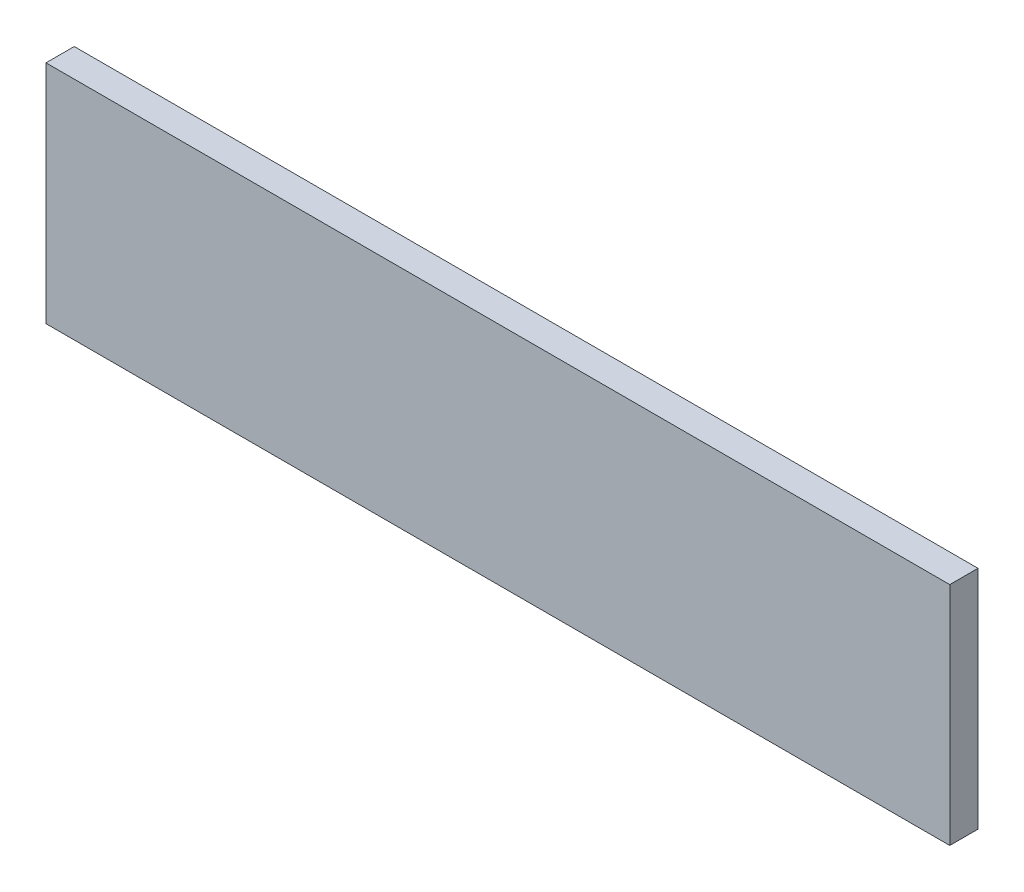
ISO-10303-21;
HEADER;
FILE_DESCRIPTION(('STEP AP214'),'2;1');
FILE_NAME('part.step','',(''),(''),'','','');
FILE_SCHEMA(('AUTOMOTIVE_DESIGN { 1 0 10303 214 1 1 1 1 }'));
ENDSEC;
DATA;
#1=APPLICATION_CONTEXT('core data for automotive mechanical design processes');
#2=APPLICATION_PROTOCOL_DEFINITION('international standard','automotive_design',2000,#1);
#3=PRODUCT_CONTEXT('',#1,'mechanical');
#4=PRODUCT('Part','Part','',(#3));
#5=PRODUCT_RELATED_PRODUCT_CATEGORY('part','',(#4));
#6=PRODUCT_DEFINITION_FORMATION('','',#4);
#7=PRODUCT_DEFINITION_CONTEXT('part definition',#1,'design');
#8=PRODUCT_DEFINITION('design','',#6,#7);
#9=PRODUCT_DEFINITION_SHAPE('','',#8);
#10=(LENGTH_UNIT() NAMED_UNIT(*) SI_UNIT(.MILLI.,.METRE.));
#11=(NAMED_UNIT(*) PLANE_ANGLE_UNIT() SI_UNIT($,.RADIAN.));
#12=(NAMED_UNIT(*) SI_UNIT($,.STERADIAN.) SOLID_ANGLE_UNIT());
#13=UNCERTAINTY_MEASURE_WITH_UNIT(LENGTH_MEASURE(1.E-05),#10,'distance_accuracy_value','');
#14=(GEOMETRIC_REPRESENTATION_CONTEXT(3) GLOBAL_UNCERTAINTY_ASSIGNED_CONTEXT((#13)) GLOBAL_UNIT_ASSIGNED_CONTEXT((#10,
#11,#12)) REPRESENTATION_CONTEXT('',''));
#15=CARTESIAN_POINT('',(0.,0.,0.));
#16=DIRECTION('',(0.,0.,1.));
#17=DIRECTION('',(1.,0.,0.));
#18=AXIS2_PLACEMENT_3D('',#15,#16,#17);
#19=CARTESIAN_POINT('',(50.8,-12.7,1.5875));
#20=DIRECTION('',(-1.,0.,0.));
#21=DIRECTION('',(0.,0.,1.));
#22=AXIS2_PLACEMENT_3D('',#19,#20,#21);
#23=PLANE('',#22);
#24=DIRECTION('',(0.,1.,0.));
#25=VECTOR('',#24,1.);
#26=CARTESIAN_POINT('',(50.8,-12.7,-1.5875));
#27=LINE('',#26,#25);
#28=CARTESIAN_POINT('',(50.8,-12.7,-1.5875));
#29=VERTEX_POINT('',#28);
#30=CARTESIAN_POINT('',(50.8,12.7,-1.5875));
#31=VERTEX_POINT('',#30);
#32=EDGE_CURVE('E113',#29,#31,#27,.T.);
#33=ORIENTED_EDGE('',*,*,#32,.T.);
#34=DIRECTION('',(0.,0.,-1.));
#35=VECTOR('',#34,1.);
#36=CARTESIAN_POINT('',(50.8,12.7,1.5875));
#37=LINE('',#36,#35);
#38=CARTESIAN_POINT('',(50.8,12.7,1.5875));
#39=VERTEX_POINT('',#38);
#40=EDGE_CURVE('E11',#39,#31,#37,.T.);
#41=ORIENTED_EDGE('',*,*,#40,.F.);
#42=DIRECTION('',(0.,1.,0.));
#43=VECTOR('',#42,1.);
#44=CARTESIAN_POINT('',(50.8,-12.7,1.5875));
#45=LINE('',#44,#43);
#46=CARTESIAN_POINT('',(50.8,-12.7,1.5875));
#47=VERTEX_POINT('',#46);
#48=EDGE_CURVE('E97',#47,#39,#45,.T.);
#49=ORIENTED_EDGE('',*,*,#48,.F.);
#50=DIRECTION('',(0.,0.,-1.));
#51=VECTOR('',#50,1.);
#52=CARTESIAN_POINT('',(50.8,-12.7,1.5875));
#53=LINE('',#52,#51);
#54=EDGE_CURVE('E109',#47,#29,#53,.T.);
#55=ORIENTED_EDGE('',*,*,#54,.T.);
#56=EDGE_LOOP('',(#33,#41,#49,#55));
#57=FACE_BOUND('',#56,.T.);
#58=ADVANCED_FACE('F45',(#57),#23,.F.);
#59=CARTESIAN_POINT('',(-50.8,12.7,1.5875));
#60=DIRECTION('',(0.,-1.,0.));
#61=DIRECTION('',(0.,0.,-1.));
#62=AXIS2_PLACEMENT_3D('',#59,#60,#61);
#63=PLANE('',#62);
#64=DIRECTION('',(-1.,0.,0.));
#65=VECTOR('',#64,1.);
#66=CARTESIAN_POINT('',(-50.8,12.7,-1.5875));
#67=LINE('',#66,#65);
#68=CARTESIAN_POINT('',(-50.8,12.7,-1.5875));
#69=VERTEX_POINT('',#68);
#70=EDGE_CURVE('E102',#31,#69,#67,.T.);
#71=ORIENTED_EDGE('',*,*,#70,.T.);
#72=DIRECTION('',(0.,0.,-1.));
#73=VECTOR('',#72,1.);
#74=CARTESIAN_POINT('',(-50.8,12.7,1.5875));
#75=LINE('',#74,#73);
#76=CARTESIAN_POINT('',(-50.8,12.7,1.5875));
#77=VERTEX_POINT('',#76);
#78=EDGE_CURVE('E54',#77,#69,#75,.T.);
#79=ORIENTED_EDGE('',*,*,#78,.F.);
#80=DIRECTION('',(-1.,0.,0.));
#81=VECTOR('',#80,1.);
#82=CARTESIAN_POINT('',(-50.8,12.7,1.5875));
#83=LINE('',#82,#81);
#84=EDGE_CURVE('E92',#39,#77,#83,.T.);
#85=ORIENTED_EDGE('',*,*,#84,.F.);
#86=ORIENTED_EDGE('',*,*,#40,.T.);
#87=EDGE_LOOP('',(#71,#79,#85,#86));
#88=FACE_BOUND('',#87,.T.);
#89=ADVANCED_FACE('F101',(#88),#63,.F.);
#90=CARTESIAN_POINT('',(-50.8,-12.7,1.5875));
#91=DIRECTION('',(1.,0.,0.));
#92=DIRECTION('',(0.,0.,-1.));
#93=AXIS2_PLACEMENT_3D('',#90,#91,#92);
#94=PLANE('',#93);
#95=DIRECTION('',(0.,-1.,0.));
#96=VECTOR('',#95,1.);
#97=CARTESIAN_POINT('',(-50.8,-12.7,-1.5875));
#98=LINE('',#97,#96);
#99=CARTESIAN_POINT('',(-50.8,-12.7,-1.5875));
#100=VERTEX_POINT('',#99);
#101=EDGE_CURVE('E79',#69,#100,#98,.T.);
#102=ORIENTED_EDGE('',*,*,#101,.T.);
#103=DIRECTION('',(0.,0.,-1.));
#104=VECTOR('',#103,1.);
#105=CARTESIAN_POINT('',(-50.8,-12.7,1.5875));
#106=LINE('',#105,#104);
#107=CARTESIAN_POINT('',(-50.8,-12.7,1.5875));
#108=VERTEX_POINT('',#107);
#109=EDGE_CURVE('E104',#108,#100,#106,.T.);
#110=ORIENTED_EDGE('',*,*,#109,.F.);
#111=DIRECTION('',(0.,-1.,0.));
#112=VECTOR('',#111,1.);
#113=CARTESIAN_POINT('',(-50.8,-12.7,1.5875));
#114=LINE('',#113,#112);
#115=EDGE_CURVE('E95',#77,#108,#114,.T.);
#116=ORIENTED_EDGE('',*,*,#115,.F.);
#117=ORIENTED_EDGE('',*,*,#78,.T.);
#118=EDGE_LOOP('',(#102,#110,#116,#117));
#119=FACE_BOUND('',#118,.T.);
#120=ADVANCED_FACE('F105',(#119),#94,.F.);
#121=CARTESIAN_POINT('',(-50.8,-12.7,1.5875));
#122=DIRECTION('',(0.,1.,0.));
#123=DIRECTION('',(0.,0.,1.));
#124=AXIS2_PLACEMENT_3D('',#121,#122,#123);
#125=PLANE('',#124);
#126=DIRECTION('',(1.,0.,0.));
#127=VECTOR('',#126,1.);
#128=CARTESIAN_POINT('',(-50.8,-12.7,-1.5875));
#129=LINE('',#128,#127);
#130=EDGE_CURVE('E85',#100,#29,#129,.T.);
#131=ORIENTED_EDGE('',*,*,#130,.T.);
#132=ORIENTED_EDGE('',*,*,#54,.F.);
#133=DIRECTION('',(1.,0.,0.));
#134=VECTOR('',#133,1.);
#135=CARTESIAN_POINT('',(-50.8,-12.7,1.5875));
#136=LINE('',#135,#134);
#137=EDGE_CURVE('E62',#108,#47,#136,.T.);
#138=ORIENTED_EDGE('',*,*,#137,.F.);
#139=ORIENTED_EDGE('',*,*,#109,.T.);
#140=EDGE_LOOP('',(#131,#132,#138,#139));
#141=FACE_BOUND('',#140,.T.);
#142=ADVANCED_FACE('F126',(#141),#125,.F.);
#143=CARTESIAN_POINT('',(0.,0.,1.5875));
#144=DIRECTION('',(0.,0.,-1.));
#145=DIRECTION('',(-1.,0.,0.));
#146=AXIS2_PLACEMENT_3D('',#143,#144,#145);
#147=PLANE('',#146);
#148=ORIENTED_EDGE('',*,*,#48,.T.);
#149=ORIENTED_EDGE('',*,*,#84,.T.);
#150=ORIENTED_EDGE('',*,*,#115,.T.);
#151=ORIENTED_EDGE('',*,*,#137,.T.);
#152=EDGE_LOOP('',(#148,#149,#150,#151));
#153=FACE_BOUND('',#152,.T.);
#154=ADVANCED_FACE('F93',(#153),#147,.F.);
#155=CARTESIAN_POINT('',(0.,0.,-1.5875));
#156=DIRECTION('',(0.,0.,-1.));
#157=DIRECTION('',(-1.,0.,0.));
#158=AXIS2_PLACEMENT_3D('',#155,#156,#157);
#159=PLANE('',#158);
#160=ORIENTED_EDGE('',*,*,#32,.F.);
#161=ORIENTED_EDGE('',*,*,#130,.F.);
#162=ORIENTED_EDGE('',*,*,#101,.F.);
#163=ORIENTED_EDGE('',*,*,#70,.F.);
#164=EDGE_LOOP('',(#160,#161,#162,#163));
#165=FACE_BOUND('',#164,.T.);
#166=ADVANCED_FACE('F129',(#165),#159,.T.);
#167=CLOSED_SHELL('',(#58,#89,#120,#142,#154,#166));
#168=MANIFOLD_SOLID_BREP('B2',#167);
#169=ADVANCED_BREP_SHAPE_REPRESENTATION('',(#18,#168),#14);
#170=SHAPE_DEFINITION_REPRESENTATION(#9,#169);
ENDSEC;
END-ISO-10303-21;
